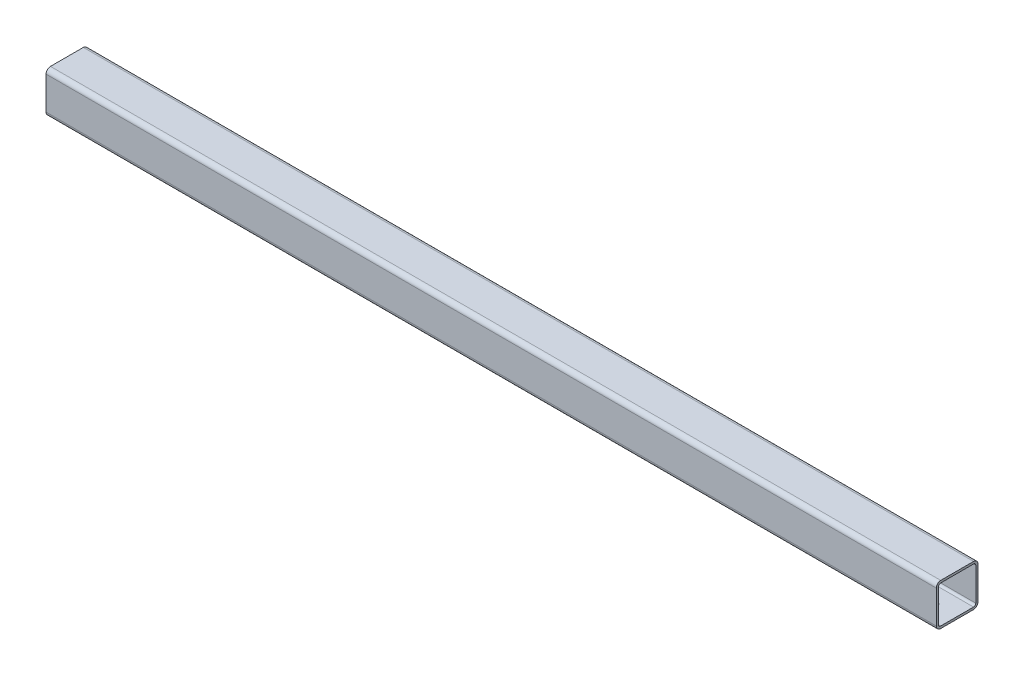
ISO-10303-21;
HEADER;
FILE_DESCRIPTION(('STEP AP214'),'2;1');
FILE_NAME('part.step','',(''),(''),'','','');
FILE_SCHEMA(('AUTOMOTIVE_DESIGN { 1 0 10303 214 1 1 1 1 }'));
ENDSEC;
DATA;
#1=APPLICATION_CONTEXT('core data for automotive mechanical design processes');
#2=APPLICATION_PROTOCOL_DEFINITION('international standard','automotive_design',2000,#1);
#3=PRODUCT_CONTEXT('',#1,'mechanical');
#4=PRODUCT('Part','Part','',(#3));
#5=PRODUCT_RELATED_PRODUCT_CATEGORY('part','',(#4));
#6=PRODUCT_DEFINITION_FORMATION('','',#4);
#7=PRODUCT_DEFINITION_CONTEXT('part definition',#1,'design');
#8=PRODUCT_DEFINITION('design','',#6,#7);
#9=PRODUCT_DEFINITION_SHAPE('','',#8);
#10=(LENGTH_UNIT() NAMED_UNIT(*) SI_UNIT(.MILLI.,.METRE.));
#11=(NAMED_UNIT(*) PLANE_ANGLE_UNIT() SI_UNIT($,.RADIAN.));
#12=(NAMED_UNIT(*) SI_UNIT($,.STERADIAN.) SOLID_ANGLE_UNIT());
#13=UNCERTAINTY_MEASURE_WITH_UNIT(LENGTH_MEASURE(1.E-05),#10,'distance_accuracy_value','');
#14=(GEOMETRIC_REPRESENTATION_CONTEXT(3) GLOBAL_UNCERTAINTY_ASSIGNED_CONTEXT((#13)) GLOBAL_UNIT_ASSIGNED_CONTEXT((#10,
#11,#12)) REPRESENTATION_CONTEXT('',''));
#15=CARTESIAN_POINT('',(0.,0.,0.));
#16=DIRECTION('',(0.,0.,1.));
#17=DIRECTION('',(1.,0.,0.));
#18=AXIS2_PLACEMENT_3D('',#15,#16,#17);
#19=CARTESIAN_POINT('',(609.,-40.,409.999999999983));
#20=DIRECTION('',(0.,-1.,0.));
#21=DIRECTION('',(0.,0.,-1.));
#22=AXIS2_PLACEMENT_3D('',#19,#20,#21);
#23=CYLINDRICAL_SURFACE('',#22,3.39999999999996);
#24=CARTESIAN_POINT('',(609.,-30.,409.999999999983));
#25=DIRECTION('',(0.,-1.,0.));
#26=DIRECTION('',(0.,0.,-1.));
#27=AXIS2_PLACEMENT_3D('',#24,#25,#26);
#28=CIRCLE('',#27,3.39999999999996);
#29=CARTESIAN_POINT('',(609.,-30.,406.599999999983));
#30=VERTEX_POINT('',#29);
#31=EDGE_CURVE('E182',#30,#30,#28,.T.);
#32=ORIENTED_EDGE('',*,*,#31,.T.);
#33=EDGE_LOOP('',(#32));
#34=FACE_BOUND('',#33,.T.);
#35=CARTESIAN_POINT('',(609.,-26.7999999999999,409.999999999983));
#36=DIRECTION('',(0.,-1.,0.));
#37=DIRECTION('',(0.,0.,-1.));
#38=AXIS2_PLACEMENT_3D('',#35,#36,#37);
#39=CIRCLE('',#38,3.39999999999996);
#40=CARTESIAN_POINT('',(609.,-26.7999999999999,406.599999999983));
#41=VERTEX_POINT('',#40);
#42=EDGE_CURVE('E20',#41,#41,#39,.T.);
#43=ORIENTED_EDGE('',*,*,#42,.F.);
#44=EDGE_LOOP('',(#43));
#45=FACE_BOUND('',#44,.T.);
#46=ADVANCED_FACE('F17',(#34,#45),#23,.F.);
#47=CARTESIAN_POINT('',(469.,-40.,409.999999999987));
#48=DIRECTION('',(0.,-1.,0.));
#49=DIRECTION('',(0.,0.,-1.));
#50=AXIS2_PLACEMENT_3D('',#47,#48,#49);
#51=CYLINDRICAL_SURFACE('',#50,3.40000000000001);
#52=CARTESIAN_POINT('',(469.,-30.,409.999999999987));
#53=DIRECTION('',(0.,-1.,0.));
#54=DIRECTION('',(0.,0.,-1.));
#55=AXIS2_PLACEMENT_3D('',#52,#53,#54);
#56=CIRCLE('',#55,3.40000000000001);
#57=CARTESIAN_POINT('',(469.,-30.,406.599999999987));
#58=VERTEX_POINT('',#57);
#59=EDGE_CURVE('E241',#58,#58,#56,.T.);
#60=ORIENTED_EDGE('',*,*,#59,.T.);
#61=EDGE_LOOP('',(#60));
#62=FACE_BOUND('',#61,.T.);
#63=CARTESIAN_POINT('',(469.,-26.7999999999999,409.999999999987));
#64=DIRECTION('',(0.,-1.,0.));
#65=DIRECTION('',(0.,0.,-1.));
#66=AXIS2_PLACEMENT_3D('',#63,#64,#65);
#67=CIRCLE('',#66,3.40000000000001);
#68=CARTESIAN_POINT('',(469.,-26.7999999999999,406.599999999987));
#69=VERTEX_POINT('',#68);
#70=EDGE_CURVE('E250',#69,#69,#67,.T.);
#71=ORIENTED_EDGE('',*,*,#70,.F.);
#72=EDGE_LOOP('',(#71));
#73=FACE_BOUND('',#72,.T.);
#74=ADVANCED_FACE('F260',(#62,#73),#51,.F.);
#75=CARTESIAN_POINT('',(-469.,-40.,410.000000000013));
#76=DIRECTION('',(0.,-1.,0.));
#77=DIRECTION('',(0.,0.,-1.));
#78=AXIS2_PLACEMENT_3D('',#75,#76,#77);
#79=CYLINDRICAL_SURFACE('',#78,3.40000000000001);
#80=CARTESIAN_POINT('',(-469.,-30.,410.000000000013));
#81=DIRECTION('',(0.,-1.,0.));
#82=DIRECTION('',(0.,0.,-1.));
#83=AXIS2_PLACEMENT_3D('',#80,#81,#82);
#84=CIRCLE('',#83,3.40000000000001);
#85=CARTESIAN_POINT('',(-469.,-30.,406.600000000013));
#86=VERTEX_POINT('',#85);
#87=EDGE_CURVE('E238',#86,#86,#84,.T.);
#88=ORIENTED_EDGE('',*,*,#87,.T.);
#89=EDGE_LOOP('',(#88));
#90=FACE_BOUND('',#89,.T.);
#91=CARTESIAN_POINT('',(-469.,-26.7999999999999,410.000000000013));
#92=DIRECTION('',(0.,-1.,0.));
#93=DIRECTION('',(0.,0.,-1.));
#94=AXIS2_PLACEMENT_3D('',#91,#92,#93);
#95=CIRCLE('',#94,3.40000000000001);
#96=CARTESIAN_POINT('',(-469.,-26.7999999999999,406.600000000013));
#97=VERTEX_POINT('',#96);
#98=EDGE_CURVE('E248',#97,#97,#95,.T.);
#99=ORIENTED_EDGE('',*,*,#98,.F.);
#100=EDGE_LOOP('',(#99));
#101=FACE_BOUND('',#100,.T.);
#102=ADVANCED_FACE('F266',(#90,#101),#79,.F.);
#103=CARTESIAN_POINT('',(-609.,-40.,410.000000000017));
#104=DIRECTION('',(0.,-1.,0.));
#105=DIRECTION('',(0.,0.,-1.));
#106=AXIS2_PLACEMENT_3D('',#103,#104,#105);
#107=CYLINDRICAL_SURFACE('',#106,3.39999999999996);
#108=CARTESIAN_POINT('',(-609.,-30.,410.000000000017));
#109=DIRECTION('',(0.,-1.,0.));
#110=DIRECTION('',(0.,0.,-1.));
#111=AXIS2_PLACEMENT_3D('',#108,#109,#110);
#112=CIRCLE('',#111,3.39999999999996);
#113=CARTESIAN_POINT('',(-609.,-30.,406.600000000017));
#114=VERTEX_POINT('',#113);
#115=EDGE_CURVE('E179',#114,#114,#112,.T.);
#116=ORIENTED_EDGE('',*,*,#115,.T.);
#117=EDGE_LOOP('',(#116));
#118=FACE_BOUND('',#117,.T.);
#119=CARTESIAN_POINT('',(-609.,-26.7999999999999,410.000000000017));
#120=DIRECTION('',(0.,-1.,0.));
#121=DIRECTION('',(0.,0.,-1.));
#122=AXIS2_PLACEMENT_3D('',#119,#120,#121);
#123=CIRCLE('',#122,3.39999999999996);
#124=CARTESIAN_POINT('',(-609.,-26.7999999999999,406.600000000017));
#125=VERTEX_POINT('',#124);
#126=EDGE_CURVE('E190',#125,#125,#123,.T.);
#127=ORIENTED_EDGE('',*,*,#126,.F.);
#128=EDGE_LOOP('',(#127));
#129=FACE_BOUND('',#128,.T.);
#130=ADVANCED_FACE('F335',(#118,#129),#107,.F.);
#131=CARTESIAN_POINT('',(669.999999999999,26.7999999999999,386.399999999981));
#132=DIRECTION('',(0.,-1.,0.));
#133=DIRECTION('',(0.,0.,-1.));
#134=AXIS2_PLACEMENT_3D('',#131,#132,#133);
#135=PLANE('',#134);
#136=DIRECTION('',(-1.,0.,0.));
#137=VECTOR('',#136,1.);
#138=CARTESIAN_POINT('',(669.999999999999,26.8,386.399999999981));
#139=LINE('',#138,#137);
#140=CARTESIAN_POINT('',(-640.000000000001,26.8,386.400000000018));
#141=VERTEX_POINT('',#140);
#142=CARTESIAN_POINT('',(639.999999999999,26.8,386.399999999982));
#143=VERTEX_POINT('',#142);
#144=EDGE_CURVE('E195',#141,#143,#139,.F.);
#145=ORIENTED_EDGE('',*,*,#144,.T.);
#146=DIRECTION('',(0.,0.,-1.));
#147=VECTOR('',#146,1.);
#148=CARTESIAN_POINT('',(640.000000000021,26.7999999999999,1169.99999999998));
#149=LINE('',#148,#147);
#150=CARTESIAN_POINT('',(640.,26.8,433.599999999982));
#151=VERTEX_POINT('',#150);
#152=EDGE_CURVE('E222',#151,#143,#149,.T.);
#153=ORIENTED_EDGE('',*,*,#152,.F.);
#154=DIRECTION('',(-1.,0.,0.));
#155=VECTOR('',#154,1.);
#156=CARTESIAN_POINT('',(670.,26.8000000000001,433.599999999981));
#157=LINE('',#156,#155);
#158=CARTESIAN_POINT('',(-640.,26.8,433.600000000018));
#159=VERTEX_POINT('',#158);
#160=EDGE_CURVE('E142',#151,#159,#157,.T.);
#161=ORIENTED_EDGE('',*,*,#160,.T.);
#162=DIRECTION('',(0.,0.,1.));
#163=VECTOR('',#162,1.);
#164=CARTESIAN_POINT('',(-639.999999999979,26.7999999999999,1170.00000000002));
#165=LINE('',#164,#163);
#166=EDGE_CURVE('E156',#141,#159,#165,.T.);
#167=ORIENTED_EDGE('',*,*,#166,.F.);
#168=EDGE_LOOP('',(#145,#153,#161,#167));
#169=FACE_BOUND('',#168,.T.);
#170=ADVANCED_FACE('F331',(#169),#135,.T.);
#171=CARTESIAN_POINT('',(669.999999999999,23.6000000000001,386.399999999981));
#172=DIRECTION('',(-1.,0.,0.));
#173=DIRECTION('',(0.,0.,1.));
#174=AXIS2_PLACEMENT_3D('',#171,#172,#173);
#175=CYLINDRICAL_SURFACE('',#174,3.19999999999998);
#176=CARTESIAN_POINT('',(-640.000000000001,23.6000000000001,386.400000000018));
#177=DIRECTION('',(-1.,0.,0.));
#178=DIRECTION('',(0.,0.,1.));
#179=AXIS2_PLACEMENT_3D('',#176,#177,#178);
#180=CIRCLE('',#179,3.19999999999998);
#181=CARTESIAN_POINT('',(-640.000000000001,23.6000000000001,383.200000000018));
#182=VERTEX_POINT('',#181);
#183=EDGE_CURVE('E158',#182,#141,#180,.F.);
#184=ORIENTED_EDGE('',*,*,#183,.F.);
#185=DIRECTION('',(1.,0.,0.));
#186=VECTOR('',#185,1.);
#187=CARTESIAN_POINT('',(669.999999999999,23.6000000000001,383.199999999981));
#188=LINE('',#187,#186);
#189=CARTESIAN_POINT('',(639.999999999999,23.6000000000001,383.199999999982));
#190=VERTEX_POINT('',#189);
#191=EDGE_CURVE('E193',#190,#182,#188,.F.);
#192=ORIENTED_EDGE('',*,*,#191,.F.);
#193=CARTESIAN_POINT('',(639.999999999999,23.6000000000001,386.399999999982));
#194=DIRECTION('',(-1.,0.,0.));
#195=DIRECTION('',(0.,0.,1.));
#196=AXIS2_PLACEMENT_3D('',#193,#194,#195);
#197=CIRCLE('',#196,3.19999999999998);
#198=EDGE_CURVE('E219',#143,#190,#197,.T.);
#199=ORIENTED_EDGE('',*,*,#198,.F.);
#200=ORIENTED_EDGE('',*,*,#144,.F.);
#201=EDGE_LOOP('',(#184,#192,#199,#200));
#202=FACE_BOUND('',#201,.T.);
#203=ADVANCED_FACE('F327',(#202),#175,.F.);
#204=CARTESIAN_POINT('',(669.999999999999,23.6000000000001,383.199999999981));
#205=DIRECTION('',(0.,0.,1.));
#206=DIRECTION('',(0.,-1.,0.));
#207=AXIS2_PLACEMENT_3D('',#204,#205,#206);
#208=PLANE('',#207);
#209=DIRECTION('',(-1.,0.,0.));
#210=VECTOR('',#209,1.);
#211=CARTESIAN_POINT('',(669.999999999999,-23.6000000000001,383.199999999981));
#212=LINE('',#211,#210);
#213=CARTESIAN_POINT('',(-640.000000000001,-23.6000000000001,383.200000000018));
#214=VERTEX_POINT('',#213);
#215=CARTESIAN_POINT('',(639.999999999999,-23.6000000000001,383.199999999982));
#216=VERTEX_POINT('',#215);
#217=EDGE_CURVE('E191',#214,#216,#212,.F.);
#218=ORIENTED_EDGE('',*,*,#217,.T.);
#219=DIRECTION('',(0.,1.,0.));
#220=VECTOR('',#219,1.);
#221=CARTESIAN_POINT('',(639.999999999999,-23.6000000000001,383.199999999982));
#222=LINE('',#221,#220);
#223=EDGE_CURVE('E218',#190,#216,#222,.F.);
#224=ORIENTED_EDGE('',*,*,#223,.F.);
#225=ORIENTED_EDGE('',*,*,#191,.T.);
#226=DIRECTION('',(0.,1.,0.));
#227=VECTOR('',#226,1.);
#228=CARTESIAN_POINT('',(-640.000000000001,23.6000000000001,383.200000000018));
#229=LINE('',#228,#227);
#230=EDGE_CURVE('E159',#214,#182,#229,.T.);
#231=ORIENTED_EDGE('',*,*,#230,.F.);
#232=EDGE_LOOP('',(#218,#224,#225,#231));
#233=FACE_BOUND('',#232,.T.);
#234=ADVANCED_FACE('F323',(#233),#208,.T.);
#235=CARTESIAN_POINT('',(669.999999999999,-23.6000000000001,386.399999999981));
#236=DIRECTION('',(-1.,0.,0.));
#237=DIRECTION('',(0.,0.,1.));
#238=AXIS2_PLACEMENT_3D('',#235,#236,#237);
#239=CYLINDRICAL_SURFACE('',#238,3.19999999999998);
#240=CARTESIAN_POINT('',(-640.000000000001,-23.6000000000001,386.400000000018));
#241=DIRECTION('',(-1.,0.,0.));
#242=DIRECTION('',(0.,0.,1.));
#243=AXIS2_PLACEMENT_3D('',#240,#241,#242);
#244=CIRCLE('',#243,3.19999999999998);
#245=CARTESIAN_POINT('',(-640.000000000001,-26.7999999999999,386.400000000018));
#246=VERTEX_POINT('',#245);
#247=EDGE_CURVE('E162',#246,#214,#244,.F.);
#248=ORIENTED_EDGE('',*,*,#247,.F.);
#249=DIRECTION('',(1.,0.,0.));
#250=VECTOR('',#249,1.);
#251=CARTESIAN_POINT('',(669.999999999999,-26.7999999999999,386.399999999981));
#252=LINE('',#251,#250);
#253=CARTESIAN_POINT('',(639.999999999999,-26.7999999999999,386.399999999982));
#254=VERTEX_POINT('',#253);
#255=EDGE_CURVE('E186',#254,#246,#252,.F.);
#256=ORIENTED_EDGE('',*,*,#255,.F.);
#257=CARTESIAN_POINT('',(639.999999999999,-23.6000000000001,386.399999999982));
#258=DIRECTION('',(-1.,0.,0.));
#259=DIRECTION('',(0.,0.,1.));
#260=AXIS2_PLACEMENT_3D('',#257,#258,#259);
#261=CIRCLE('',#260,3.19999999999998);
#262=EDGE_CURVE('E215',#216,#254,#261,.T.);
#263=ORIENTED_EDGE('',*,*,#262,.F.);
#264=ORIENTED_EDGE('',*,*,#217,.F.);
#265=EDGE_LOOP('',(#248,#256,#263,#264));
#266=FACE_BOUND('',#265,.T.);
#267=ADVANCED_FACE('F319',(#266),#239,.F.);
#268=CARTESIAN_POINT('',(670.,-26.7999999999999,433.599999999981));
#269=DIRECTION('',(0.,1.,0.));
#270=DIRECTION('',(0.,0.,1.));
#271=AXIS2_PLACEMENT_3D('',#268,#269,#270);
#272=PLANE('',#271);
#273=DIRECTION('',(-1.,0.,0.));
#274=VECTOR('',#273,1.);
#275=CARTESIAN_POINT('',(670.,-26.8,433.599999999981));
#276=LINE('',#275,#274);
#277=CARTESIAN_POINT('',(-640.,-26.8,433.600000000018));
#278=VERTEX_POINT('',#277);
#279=CARTESIAN_POINT('',(640.,-26.8,433.599999999982));
#280=VERTEX_POINT('',#279);
#281=EDGE_CURVE('E116',#278,#280,#276,.F.);
#282=ORIENTED_EDGE('',*,*,#281,.T.);
#283=DIRECTION('',(0.,0.,-1.));
#284=VECTOR('',#283,1.);
#285=CARTESIAN_POINT('',(640.000000000021,-26.7999999999999,1169.99999999998));
#286=LINE('',#285,#284);
#287=EDGE_CURVE('E214',#254,#280,#286,.F.);
#288=ORIENTED_EDGE('',*,*,#287,.F.);
#289=ORIENTED_EDGE('',*,*,#255,.T.);
#290=DIRECTION('',(0.,0.,1.));
#291=VECTOR('',#290,1.);
#292=CARTESIAN_POINT('',(-639.999999999979,-26.7999999999999,1170.00000000002));
#293=LINE('',#292,#291);
#294=EDGE_CURVE('E120',#278,#246,#293,.F.);
#295=ORIENTED_EDGE('',*,*,#294,.F.);
#296=EDGE_LOOP('',(#282,#288,#289,#295));
#297=FACE_BOUND('',#296,.T.);
#298=ORIENTED_EDGE('',*,*,#126,.T.);
#299=EDGE_LOOP('',(#298));
#300=FACE_BOUND('',#299,.T.);
#301=ORIENTED_EDGE('',*,*,#98,.T.);
#302=EDGE_LOOP('',(#301));
#303=FACE_BOUND('',#302,.T.);
#304=ORIENTED_EDGE('',*,*,#70,.T.);
#305=EDGE_LOOP('',(#304));
#306=FACE_BOUND('',#305,.T.);
#307=ORIENTED_EDGE('',*,*,#42,.T.);
#308=EDGE_LOOP('',(#307));
#309=FACE_BOUND('',#308,.T.);
#310=ADVANCED_FACE('F257',(#297,#300,#303,#306,#309),#272,.T.);
#311=CARTESIAN_POINT('',(670.,23.6000000000001,433.599999999981));
#312=DIRECTION('',(-1.,0.,0.));
#313=DIRECTION('',(0.,0.,1.));
#314=AXIS2_PLACEMENT_3D('',#311,#312,#313);
#315=CYLINDRICAL_SURFACE('',#314,6.40000000000002);
#316=CARTESIAN_POINT('',(640.,23.6000000000001,433.599999999982));
#317=DIRECTION('',(-1.,0.,0.));
#318=DIRECTION('',(0.,0.,1.));
#319=AXIS2_PLACEMENT_3D('',#316,#317,#318);
#320=CIRCLE('',#319,6.40000000000002);
#321=CARTESIAN_POINT('',(640.,30.,433.599999999982));
#322=VERTEX_POINT('',#321);
#323=CARTESIAN_POINT('',(640.000000000001,23.6000000000001,439.999999999982));
#324=VERTEX_POINT('',#323);
#325=EDGE_CURVE('E208',#322,#324,#320,.F.);
#326=ORIENTED_EDGE('',*,*,#325,.F.);
#327=DIRECTION('',(1.,0.,0.));
#328=VECTOR('',#327,1.);
#329=CARTESIAN_POINT('',(670.,30.,433.599999999981));
#330=LINE('',#329,#328);
#331=CARTESIAN_POINT('',(-640.,30.,433.600000000018));
#332=VERTEX_POINT('',#331);
#333=EDGE_CURVE('E167',#322,#332,#330,.F.);
#334=ORIENTED_EDGE('',*,*,#333,.T.);
#335=CARTESIAN_POINT('',(-640.,23.6000000000001,433.600000000018));
#336=DIRECTION('',(-1.,0.,0.));
#337=DIRECTION('',(0.,0.,1.));
#338=AXIS2_PLACEMENT_3D('',#335,#336,#337);
#339=CIRCLE('',#338,6.40000000000002);
#340=CARTESIAN_POINT('',(-639.999999999999,23.6000000000001,440.000000000018));
#341=VERTEX_POINT('',#340);
#342=EDGE_CURVE('E151',#341,#332,#339,.T.);
#343=ORIENTED_EDGE('',*,*,#342,.F.);
#344=DIRECTION('',(1.,0.,0.));
#345=VECTOR('',#344,1.);
#346=CARTESIAN_POINT('',(670.000000000001,23.6000000000001,439.999999999981));
#347=LINE('',#346,#345);
#348=EDGE_CURVE('E183',#341,#324,#347,.T.);
#349=ORIENTED_EDGE('',*,*,#348,.T.);
#350=EDGE_LOOP('',(#326,#334,#343,#349));
#351=FACE_BOUND('',#350,.T.);
#352=ADVANCED_FACE('F312',(#351),#315,.T.);
#353=CARTESIAN_POINT('',(670.000000000001,-23.6000000000001,439.999999999981));
#354=DIRECTION('',(0.,0.,-1.));
#355=DIRECTION('',(0.,1.,0.));
#356=AXIS2_PLACEMENT_3D('',#353,#354,#355);
#357=PLANE('',#356);
#358=DIRECTION('',(-1.,0.,0.));
#359=VECTOR('',#358,1.);
#360=CARTESIAN_POINT('',(670.000000000001,-23.6000000000001,439.999999999981));
#361=LINE('',#360,#359);
#362=CARTESIAN_POINT('',(640.000000000001,-23.6000000000001,439.999999999982));
#363=VERTEX_POINT('',#362);
#364=CARTESIAN_POINT('',(-639.999999999999,-23.6000000000001,440.000000000018));
#365=VERTEX_POINT('',#364);
#366=EDGE_CURVE('E180',#363,#365,#361,.T.);
#367=ORIENTED_EDGE('',*,*,#366,.F.);
#368=DIRECTION('',(0.,1.,0.));
#369=VECTOR('',#368,1.);
#370=CARTESIAN_POINT('',(640.000000000001,-23.6000000000001,439.999999999982));
#371=LINE('',#370,#369);
#372=EDGE_CURVE('E207',#324,#363,#371,.F.);
#373=ORIENTED_EDGE('',*,*,#372,.F.);
#374=ORIENTED_EDGE('',*,*,#348,.F.);
#375=DIRECTION('',(0.,1.,0.));
#376=VECTOR('',#375,1.);
#377=CARTESIAN_POINT('',(-639.999999999999,23.6000000000001,440.000000000018));
#378=LINE('',#377,#376);
#379=EDGE_CURVE('E152',#365,#341,#378,.T.);
#380=ORIENTED_EDGE('',*,*,#379,.F.);
#381=EDGE_LOOP('',(#367,#373,#374,#380));
#382=FACE_BOUND('',#381,.T.);
#383=ADVANCED_FACE('F308',(#382),#357,.F.);
#384=CARTESIAN_POINT('',(670.,-23.6000000000001,433.599999999981));
#385=DIRECTION('',(-1.,0.,0.));
#386=DIRECTION('',(0.,0.,1.));
#387=AXIS2_PLACEMENT_3D('',#384,#385,#386);
#388=CYLINDRICAL_SURFACE('',#387,6.40000000000002);
#389=CARTESIAN_POINT('',(640.,-23.6000000000001,433.599999999982));
#390=DIRECTION('',(-1.,0.,0.));
#391=DIRECTION('',(0.,0.,1.));
#392=AXIS2_PLACEMENT_3D('',#389,#390,#391);
#393=CIRCLE('',#392,6.40000000000002);
#394=CARTESIAN_POINT('',(640.,-30.,433.599999999982));
#395=VERTEX_POINT('',#394);
#396=EDGE_CURVE('E204',#363,#395,#393,.F.);
#397=ORIENTED_EDGE('',*,*,#396,.F.);
#398=ORIENTED_EDGE('',*,*,#366,.T.);
#399=CARTESIAN_POINT('',(-640.,-23.6000000000001,433.600000000018));
#400=DIRECTION('',(-1.,0.,0.));
#401=DIRECTION('',(0.,0.,1.));
#402=AXIS2_PLACEMENT_3D('',#399,#400,#401);
#403=CIRCLE('',#402,6.40000000000002);
#404=CARTESIAN_POINT('',(-640.,-30.,433.600000000018));
#405=VERTEX_POINT('',#404);
#406=EDGE_CURVE('E155',#405,#365,#403,.T.);
#407=ORIENTED_EDGE('',*,*,#406,.F.);
#408=DIRECTION('',(1.,0.,0.));
#409=VECTOR('',#408,1.);
#410=CARTESIAN_POINT('',(670.,-30.,433.599999999981));
#411=LINE('',#410,#409);
#412=EDGE_CURVE('E176',#405,#395,#411,.T.);
#413=ORIENTED_EDGE('',*,*,#412,.T.);
#414=EDGE_LOOP('',(#397,#398,#407,#413));
#415=FACE_BOUND('',#414,.T.);
#416=ADVANCED_FACE('F304',(#415),#388,.T.);
#417=CARTESIAN_POINT('',(670.,-30.,433.599999999981));
#418=DIRECTION('',(0.,1.,0.));
#419=DIRECTION('',(0.,0.,1.));
#420=AXIS2_PLACEMENT_3D('',#417,#418,#419);
#421=PLANE('',#420);
#422=DIRECTION('',(-1.,0.,0.));
#423=VECTOR('',#422,1.);
#424=CARTESIAN_POINT('',(669.999999999999,-30.0000000000001,386.399999999981));
#425=LINE('',#424,#423);
#426=CARTESIAN_POINT('',(639.999999999999,-30.0000000000001,386.399999999982));
#427=VERTEX_POINT('',#426);
#428=CARTESIAN_POINT('',(-640.000000000001,-30.0000000000001,386.400000000018));
#429=VERTEX_POINT('',#428);
#430=EDGE_CURVE('E174',#427,#429,#425,.T.);
#431=ORIENTED_EDGE('',*,*,#430,.F.);
#432=DIRECTION('',(0.,0.,-1.));
#433=VECTOR('',#432,1.);
#434=CARTESIAN_POINT('',(640.000000000021,-30.,1169.99999999998));
#435=LINE('',#434,#433);
#436=EDGE_CURVE('E203',#395,#427,#435,.T.);
#437=ORIENTED_EDGE('',*,*,#436,.F.);
#438=ORIENTED_EDGE('',*,*,#412,.F.);
#439=DIRECTION('',(0.,0.,1.));
#440=VECTOR('',#439,1.);
#441=CARTESIAN_POINT('',(-639.999999999979,-30.,1170.00000000002));
#442=LINE('',#441,#440);
#443=EDGE_CURVE('E139',#429,#405,#442,.T.);
#444=ORIENTED_EDGE('',*,*,#443,.F.);
#445=EDGE_LOOP('',(#431,#437,#438,#444));
#446=FACE_BOUND('',#445,.T.);
#447=ORIENTED_EDGE('',*,*,#115,.F.);
#448=EDGE_LOOP('',(#447));
#449=FACE_BOUND('',#448,.T.);
#450=ORIENTED_EDGE('',*,*,#87,.F.);
#451=EDGE_LOOP('',(#450));
#452=FACE_BOUND('',#451,.T.);
#453=ORIENTED_EDGE('',*,*,#59,.F.);
#454=EDGE_LOOP('',(#453));
#455=FACE_BOUND('',#454,.T.);
#456=ORIENTED_EDGE('',*,*,#31,.F.);
#457=EDGE_LOOP('',(#456));
#458=FACE_BOUND('',#457,.T.);
#459=ADVANCED_FACE('F300',(#446,#449,#452,#455,#458),#421,.F.);
#460=CARTESIAN_POINT('',(669.999999999999,-23.6000000000001,386.399999999981));
#461=DIRECTION('',(-1.,0.,0.));
#462=DIRECTION('',(0.,0.,1.));
#463=AXIS2_PLACEMENT_3D('',#460,#461,#462);
#464=CYLINDRICAL_SURFACE('',#463,6.40000000000002);
#465=CARTESIAN_POINT('',(639.999999999999,-23.6000000000001,386.399999999982));
#466=DIRECTION('',(-1.,0.,0.));
#467=DIRECTION('',(0.,0.,1.));
#468=AXIS2_PLACEMENT_3D('',#465,#466,#467);
#469=CIRCLE('',#468,6.40000000000002);
#470=CARTESIAN_POINT('',(639.999999999999,-23.6000000000001,379.999999999982));
#471=VERTEX_POINT('',#470);
#472=EDGE_CURVE('E200',#427,#471,#469,.F.);
#473=ORIENTED_EDGE('',*,*,#472,.F.);
#474=ORIENTED_EDGE('',*,*,#430,.T.);
#475=CARTESIAN_POINT('',(-640.000000000001,-23.6000000000001,386.400000000018));
#476=DIRECTION('',(-1.,0.,0.));
#477=DIRECTION('',(0.,0.,1.));
#478=AXIS2_PLACEMENT_3D('',#475,#476,#477);
#479=CIRCLE('',#478,6.40000000000002);
#480=CARTESIAN_POINT('',(-640.000000000001,-23.6000000000001,380.000000000018));
#481=VERTEX_POINT('',#480);
#482=EDGE_CURVE('E143',#481,#429,#479,.T.);
#483=ORIENTED_EDGE('',*,*,#482,.F.);
#484=DIRECTION('',(1.,0.,0.));
#485=VECTOR('',#484,1.);
#486=CARTESIAN_POINT('',(669.999999999999,-23.6000000000001,379.999999999981));
#487=LINE('',#486,#485);
#488=EDGE_CURVE('E171',#481,#471,#487,.T.);
#489=ORIENTED_EDGE('',*,*,#488,.T.);
#490=EDGE_LOOP('',(#473,#474,#483,#489));
#491=FACE_BOUND('',#490,.T.);
#492=ADVANCED_FACE('F296',(#491),#464,.T.);
#493=CARTESIAN_POINT('',(669.999999999999,23.6000000000001,379.999999999981));
#494=DIRECTION('',(0.,0.,1.));
#495=DIRECTION('',(0.,-1.,0.));
#496=AXIS2_PLACEMENT_3D('',#493,#494,#495);
#497=PLANE('',#496);
#498=DIRECTION('',(-1.,0.,0.));
#499=VECTOR('',#498,1.);
#500=CARTESIAN_POINT('',(669.999999999999,23.6000000000001,379.999999999981));
#501=LINE('',#500,#499);
#502=CARTESIAN_POINT('',(639.999999999999,23.6000000000001,379.999999999982));
#503=VERTEX_POINT('',#502);
#504=CARTESIAN_POINT('',(-640.000000000001,23.6000000000001,380.000000000018));
#505=VERTEX_POINT('',#504);
#506=EDGE_CURVE('E168',#503,#505,#501,.T.);
#507=ORIENTED_EDGE('',*,*,#506,.F.);
#508=DIRECTION('',(0.,1.,0.));
#509=VECTOR('',#508,1.);
#510=CARTESIAN_POINT('',(639.999999999999,-23.6000000000001,379.999999999982));
#511=LINE('',#510,#509);
#512=EDGE_CURVE('E199',#471,#503,#511,.T.);
#513=ORIENTED_EDGE('',*,*,#512,.F.);
#514=ORIENTED_EDGE('',*,*,#488,.F.);
#515=DIRECTION('',(0.,1.,0.));
#516=VECTOR('',#515,1.);
#517=CARTESIAN_POINT('',(-640.000000000001,23.6000000000001,380.000000000018));
#518=LINE('',#517,#516);
#519=EDGE_CURVE('E144',#505,#481,#518,.F.);
#520=ORIENTED_EDGE('',*,*,#519,.F.);
#521=EDGE_LOOP('',(#507,#513,#514,#520));
#522=FACE_BOUND('',#521,.T.);
#523=ADVANCED_FACE('F292',(#522),#497,.F.);
#524=CARTESIAN_POINT('',(669.999999999999,23.6000000000001,386.399999999981));
#525=DIRECTION('',(-1.,0.,0.));
#526=DIRECTION('',(0.,0.,1.));
#527=AXIS2_PLACEMENT_3D('',#524,#525,#526);
#528=CYLINDRICAL_SURFACE('',#527,6.40000000000002);
#529=CARTESIAN_POINT('',(639.999999999999,23.6000000000001,386.399999999982));
#530=DIRECTION('',(-1.,0.,0.));
#531=DIRECTION('',(0.,0.,1.));
#532=AXIS2_PLACEMENT_3D('',#529,#530,#531);
#533=CIRCLE('',#532,6.40000000000002);
#534=CARTESIAN_POINT('',(639.999999999999,30.,386.399999999982));
#535=VERTEX_POINT('',#534);
#536=EDGE_CURVE('E135',#503,#535,#533,.F.);
#537=ORIENTED_EDGE('',*,*,#536,.F.);
#538=ORIENTED_EDGE('',*,*,#506,.T.);
#539=CARTESIAN_POINT('',(-640.000000000001,23.6000000000001,386.400000000018));
#540=DIRECTION('',(-1.,0.,0.));
#541=DIRECTION('',(0.,0.,1.));
#542=AXIS2_PLACEMENT_3D('',#539,#540,#541);
#543=CIRCLE('',#542,6.40000000000002);
#544=CARTESIAN_POINT('',(-640.000000000001,30.,386.400000000018));
#545=VERTEX_POINT('',#544);
#546=EDGE_CURVE('E147',#545,#505,#543,.T.);
#547=ORIENTED_EDGE('',*,*,#546,.F.);
#548=DIRECTION('',(1.,0.,0.));
#549=VECTOR('',#548,1.);
#550=CARTESIAN_POINT('',(669.999999999999,30.,386.399999999981));
#551=LINE('',#550,#549);
#552=EDGE_CURVE('E164',#545,#535,#551,.T.);
#553=ORIENTED_EDGE('',*,*,#552,.T.);
#554=EDGE_LOOP('',(#537,#538,#547,#553));
#555=FACE_BOUND('',#554,.T.);
#556=ADVANCED_FACE('F288',(#555),#528,.T.);
#557=CARTESIAN_POINT('',(669.999999999999,30.,386.399999999981));
#558=DIRECTION('',(0.,-1.,0.));
#559=DIRECTION('',(0.,0.,-1.));
#560=AXIS2_PLACEMENT_3D('',#557,#558,#559);
#561=PLANE('',#560);
#562=ORIENTED_EDGE('',*,*,#333,.F.);
#563=DIRECTION('',(0.,0.,-1.));
#564=VECTOR('',#563,1.);
#565=CARTESIAN_POINT('',(640.000000000021,30.,1169.99999999998));
#566=LINE('',#565,#564);
#567=EDGE_CURVE('E132',#535,#322,#566,.F.);
#568=ORIENTED_EDGE('',*,*,#567,.F.);
#569=ORIENTED_EDGE('',*,*,#552,.F.);
#570=DIRECTION('',(0.,0.,1.));
#571=VECTOR('',#570,1.);
#572=CARTESIAN_POINT('',(-639.999999999979,30.,1170.00000000002));
#573=LINE('',#572,#571);
#574=EDGE_CURVE('E148',#332,#545,#573,.F.);
#575=ORIENTED_EDGE('',*,*,#574,.F.);
#576=EDGE_LOOP('',(#562,#568,#569,#575));
#577=FACE_BOUND('',#576,.T.);
#578=ADVANCED_FACE('F285',(#577),#561,.F.);
#579=CARTESIAN_POINT('',(670.,-23.6000000000001,433.599999999981));
#580=DIRECTION('',(-1.,0.,0.));
#581=DIRECTION('',(0.,0.,1.));
#582=AXIS2_PLACEMENT_3D('',#579,#580,#581);
#583=CYLINDRICAL_SURFACE('',#582,3.19999999999993);
#584=CARTESIAN_POINT('',(-640.,-23.6000000000001,433.600000000018));
#585=DIRECTION('',(-1.,0.,0.));
#586=DIRECTION('',(0.,0.,1.));
#587=AXIS2_PLACEMENT_3D('',#584,#585,#586);
#588=CIRCLE('',#587,3.19999999999993);
#589=CARTESIAN_POINT('',(-639.999999999999,-23.6000000000001,436.800000000018));
#590=VERTEX_POINT('',#589);
#591=EDGE_CURVE('E109',#590,#278,#588,.F.);
#592=ORIENTED_EDGE('',*,*,#591,.F.);
#593=DIRECTION('',(1.,0.,0.));
#594=VECTOR('',#593,1.);
#595=CARTESIAN_POINT('',(670.000000000001,-23.6000000000001,436.799999999981));
#596=LINE('',#595,#594);
#597=CARTESIAN_POINT('',(640.000000000001,-23.6000000000001,436.799999999982));
#598=VERTEX_POINT('',#597);
#599=EDGE_CURVE('E114',#598,#590,#596,.F.);
#600=ORIENTED_EDGE('',*,*,#599,.F.);
#601=CARTESIAN_POINT('',(640.,-23.6000000000001,433.599999999982));
#602=DIRECTION('',(-1.,0.,0.));
#603=DIRECTION('',(0.,0.,1.));
#604=AXIS2_PLACEMENT_3D('',#601,#602,#603);
#605=CIRCLE('',#604,3.19999999999993);
#606=EDGE_CURVE('E212',#280,#598,#605,.T.);
#607=ORIENTED_EDGE('',*,*,#606,.F.);
#608=ORIENTED_EDGE('',*,*,#281,.F.);
#609=EDGE_LOOP('',(#592,#600,#607,#608));
#610=FACE_BOUND('',#609,.T.);
#611=ADVANCED_FACE('F111',(#610),#583,.F.);
#612=CARTESIAN_POINT('',(-639.999999999979,23.6000000000001,1170.00000000002));
#613=DIRECTION('',(-1.,0.,0.));
#614=DIRECTION('',(0.,0.,1.));
#615=AXIS2_PLACEMENT_3D('',#612,#613,#614);
#616=PLANE('',#615);
#617=ORIENTED_EDGE('',*,*,#482,.T.);
#618=ORIENTED_EDGE('',*,*,#443,.T.);
#619=ORIENTED_EDGE('',*,*,#406,.T.);
#620=ORIENTED_EDGE('',*,*,#379,.T.);
#621=ORIENTED_EDGE('',*,*,#342,.T.);
#622=ORIENTED_EDGE('',*,*,#574,.T.);
#623=ORIENTED_EDGE('',*,*,#546,.T.);
#624=ORIENTED_EDGE('',*,*,#519,.T.);
#625=EDGE_LOOP('',(#617,#618,#619,#620,#621,#622,#623,#624));
#626=FACE_BOUND('',#625,.T.);
#627=CARTESIAN_POINT('',(-640.,23.6000000000001,433.600000000018));
#628=DIRECTION('',(-1.,0.,0.));
#629=DIRECTION('',(0.,0.,1.));
#630=AXIS2_PLACEMENT_3D('',#627,#628,#629);
#631=CIRCLE('',#630,3.19999999999998);
#632=CARTESIAN_POINT('',(-639.999999999999,23.6000000000001,436.800000000018));
#633=VERTEX_POINT('',#632);
#634=EDGE_CURVE('E127',#159,#633,#631,.F.);
#635=ORIENTED_EDGE('',*,*,#634,.T.);
#636=DIRECTION('',(0.,1.,0.));
#637=VECTOR('',#636,1.);
#638=CARTESIAN_POINT('',(-639.999999999999,-23.6000000000001,436.800000000018));
#639=LINE('',#638,#637);
#640=EDGE_CURVE('E123',#590,#633,#639,.T.);
#641=ORIENTED_EDGE('',*,*,#640,.F.);
#642=ORIENTED_EDGE('',*,*,#591,.T.);
#643=ORIENTED_EDGE('',*,*,#294,.T.);
#644=ORIENTED_EDGE('',*,*,#247,.T.);
#645=ORIENTED_EDGE('',*,*,#230,.T.);
#646=ORIENTED_EDGE('',*,*,#183,.T.);
#647=ORIENTED_EDGE('',*,*,#166,.T.);
#648=EDGE_LOOP('',(#635,#641,#642,#643,#644,#645,#646,#647));
#649=FACE_BOUND('',#648,.T.);
#650=ADVANCED_FACE('F124',(#626,#649),#616,.T.);
#651=CARTESIAN_POINT('',(670.,23.6000000000001,433.599999999981));
#652=DIRECTION('',(-1.,0.,0.));
#653=DIRECTION('',(0.,0.,1.));
#654=AXIS2_PLACEMENT_3D('',#651,#652,#653);
#655=CYLINDRICAL_SURFACE('',#654,3.19999999999998);
#656=ORIENTED_EDGE('',*,*,#634,.F.);
#657=ORIENTED_EDGE('',*,*,#160,.F.);
#658=CARTESIAN_POINT('',(640.,23.6000000000001,433.599999999982));
#659=DIRECTION('',(-1.,0.,0.));
#660=DIRECTION('',(0.,0.,1.));
#661=AXIS2_PLACEMENT_3D('',#658,#659,#660);
#662=CIRCLE('',#661,3.19999999999998);
#663=CARTESIAN_POINT('',(640.000000000001,23.6000000000001,436.799999999982));
#664=VERTEX_POINT('',#663);
#665=EDGE_CURVE('E35',#664,#151,#662,.T.);
#666=ORIENTED_EDGE('',*,*,#665,.F.);
#667=DIRECTION('',(1.,0.,0.));
#668=VECTOR('',#667,1.);
#669=CARTESIAN_POINT('',(670.000000000001,23.6000000000001,436.799999999981));
#670=LINE('',#669,#668);
#671=EDGE_CURVE('E26',#633,#664,#670,.T.);
#672=ORIENTED_EDGE('',*,*,#671,.F.);
#673=EDGE_LOOP('',(#656,#657,#666,#672));
#674=FACE_BOUND('',#673,.T.);
#675=ADVANCED_FACE('F274',(#674),#655,.F.);
#676=CARTESIAN_POINT('',(640.000000000021,-23.6000000000001,1169.99999999998));
#677=DIRECTION('',(1.,0.,0.));
#678=DIRECTION('',(0.,0.,-1.));
#679=AXIS2_PLACEMENT_3D('',#676,#677,#678);
#680=PLANE('',#679);
#681=ORIENTED_EDGE('',*,*,#536,.T.);
#682=ORIENTED_EDGE('',*,*,#567,.T.);
#683=ORIENTED_EDGE('',*,*,#325,.T.);
#684=ORIENTED_EDGE('',*,*,#372,.T.);
#685=ORIENTED_EDGE('',*,*,#396,.T.);
#686=ORIENTED_EDGE('',*,*,#436,.T.);
#687=ORIENTED_EDGE('',*,*,#472,.T.);
#688=ORIENTED_EDGE('',*,*,#512,.T.);
#689=EDGE_LOOP('',(#681,#682,#683,#684,#685,#686,#687,#688));
#690=FACE_BOUND('',#689,.T.);
#691=DIRECTION('',(0.,1.,0.));
#692=VECTOR('',#691,1.);
#693=CARTESIAN_POINT('',(640.000000000001,-23.6000000000001,436.799999999982));
#694=LINE('',#693,#692);
#695=EDGE_CURVE('E11',#664,#598,#694,.F.);
#696=ORIENTED_EDGE('',*,*,#695,.F.);
#697=ORIENTED_EDGE('',*,*,#665,.T.);
#698=ORIENTED_EDGE('',*,*,#152,.T.);
#699=ORIENTED_EDGE('',*,*,#198,.T.);
#700=ORIENTED_EDGE('',*,*,#223,.T.);
#701=ORIENTED_EDGE('',*,*,#262,.T.);
#702=ORIENTED_EDGE('',*,*,#287,.T.);
#703=ORIENTED_EDGE('',*,*,#606,.T.);
#704=EDGE_LOOP('',(#696,#697,#698,#699,#700,#701,#702,#703));
#705=FACE_BOUND('',#704,.T.);
#706=ADVANCED_FACE('F269',(#690,#705),#680,.T.);
#707=CARTESIAN_POINT('',(670.000000000001,-23.6000000000001,436.799999999981));
#708=DIRECTION('',(0.,0.,-1.));
#709=DIRECTION('',(0.,1.,0.));
#710=AXIS2_PLACEMENT_3D('',#707,#708,#709);
#711=PLANE('',#710);
#712=ORIENTED_EDGE('',*,*,#671,.T.);
#713=ORIENTED_EDGE('',*,*,#695,.T.);
#714=ORIENTED_EDGE('',*,*,#599,.T.);
#715=ORIENTED_EDGE('',*,*,#640,.T.);
#716=EDGE_LOOP('',(#712,#713,#714,#715));
#717=FACE_BOUND('',#716,.T.);
#718=ADVANCED_FACE('F131',(#717),#711,.T.);
#719=CLOSED_SHELL('',(#46,#74,#102,#130,#170,#203,#234,#267,#310,#352,#383,#416,#459,#492,#523,
#556,#578,#611,#650,#675,#706,#718));
#720=MANIFOLD_SOLID_BREP('B1',#719);
#721=ADVANCED_BREP_SHAPE_REPRESENTATION('',(#18,#720),#14);
#722=SHAPE_DEFINITION_REPRESENTATION(#9,#721);
ENDSEC;
END-ISO-10303-21;
